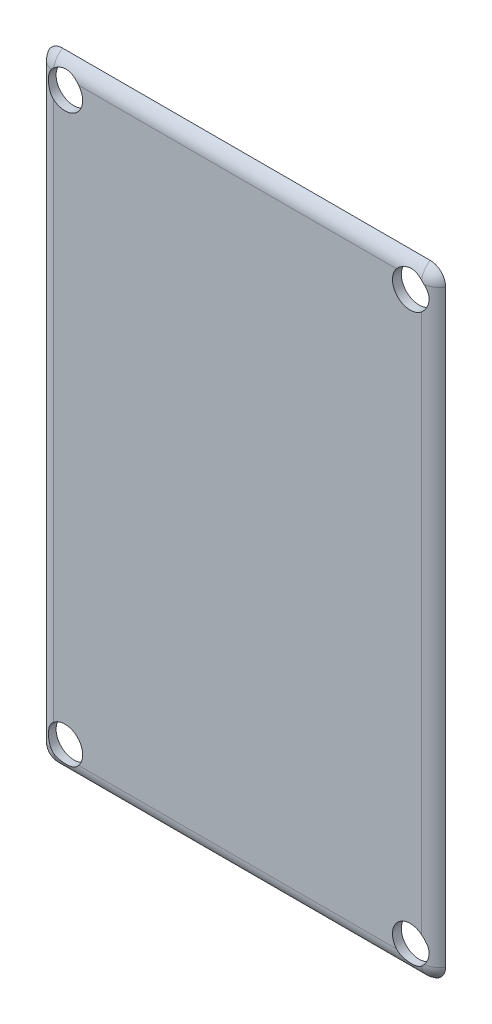
ISO-10303-21;
HEADER;
FILE_DESCRIPTION(('STEP AP214'),'2;1');
FILE_NAME('part.step','',(''),(''),'','','');
FILE_SCHEMA(('AUTOMOTIVE_DESIGN { 1 0 10303 214 1 1 1 1 }'));
ENDSEC;
DATA;
#1=APPLICATION_CONTEXT('core data for automotive mechanical design processes');
#2=APPLICATION_PROTOCOL_DEFINITION('international standard','automotive_design',2000,#1);
#3=PRODUCT_CONTEXT('',#1,'mechanical');
#4=PRODUCT('Part','Part','',(#3));
#5=PRODUCT_RELATED_PRODUCT_CATEGORY('part','',(#4));
#6=PRODUCT_DEFINITION_FORMATION('','',#4);
#7=PRODUCT_DEFINITION_CONTEXT('part definition',#1,'design');
#8=PRODUCT_DEFINITION('design','',#6,#7);
#9=PRODUCT_DEFINITION_SHAPE('','',#8);
#10=(LENGTH_UNIT() NAMED_UNIT(*) SI_UNIT(.MILLI.,.METRE.));
#11=(NAMED_UNIT(*) PLANE_ANGLE_UNIT() SI_UNIT($,.RADIAN.));
#12=(NAMED_UNIT(*) SI_UNIT($,.STERADIAN.) SOLID_ANGLE_UNIT());
#13=UNCERTAINTY_MEASURE_WITH_UNIT(LENGTH_MEASURE(1.E-05),#10,'distance_accuracy_value','');
#14=(GEOMETRIC_REPRESENTATION_CONTEXT(3) GLOBAL_UNCERTAINTY_ASSIGNED_CONTEXT((#13)) GLOBAL_UNIT_ASSIGNED_CONTEXT((#10,
#11,#12)) REPRESENTATION_CONTEXT('',''));
#15=CARTESIAN_POINT('',(0.,0.,0.));
#16=DIRECTION('',(0.,0.,1.));
#17=DIRECTION('',(1.,0.,0.));
#18=AXIS2_PLACEMENT_3D('',#15,#16,#17);
#19=CARTESIAN_POINT('',(0.,0.,1.));
#20=DIRECTION('',(0.,0.,-1.));
#21=DIRECTION('',(-1.,0.,0.));
#22=AXIS2_PLACEMENT_3D('',#19,#20,#21);
#23=PLANE('',#22);
#24=CARTESIAN_POINT('',(3.,3.,1.));
#25=DIRECTION('',(0.,0.,1.));
#26=DIRECTION('',(1.,0.,0.));
#27=AXIS2_PLACEMENT_3D('',#24,#25,#26);
#28=CIRCLE('',#27,2.);
#29=CARTESIAN_POINT('',(4.54670774402059,1.73205080756888,1.));
#30=VERTEX_POINT('',#29);
#31=CARTESIAN_POINT('',(1.73205080756888,4.54670774402059,1.));
#32=VERTEX_POINT('',#31);
#33=EDGE_CURVE('E132',#30,#32,#28,.T.);
#34=ORIENTED_EDGE('',*,*,#33,.F.);
#35=DIRECTION('',(-1.,0.,0.));
#36=VECTOR('',#35,1.);
#37=CARTESIAN_POINT('',(0.,1.73205080756888,1.));
#38=LINE('',#37,#36);
#39=CARTESIAN_POINT('',(40.4532922559794,1.73205080756888,1.));
#40=VERTEX_POINT('',#39);
#41=EDGE_CURVE('E140',#30,#40,#38,.F.);
#42=ORIENTED_EDGE('',*,*,#41,.T.);
#43=CARTESIAN_POINT('',(42.,3.,1.));
#44=DIRECTION('',(0.,0.,1.));
#45=DIRECTION('',(1.,0.,0.));
#46=AXIS2_PLACEMENT_3D('',#43,#44,#45);
#47=CIRCLE('',#46,2.);
#48=CARTESIAN_POINT('',(43.2679491924311,4.5467077440206,1.));
#49=VERTEX_POINT('',#48);
#50=EDGE_CURVE('E305',#49,#40,#47,.T.);
#51=ORIENTED_EDGE('',*,*,#50,.F.);
#52=DIRECTION('',(0.,-1.,0.));
#53=VECTOR('',#52,1.);
#54=CARTESIAN_POINT('',(43.2679491924311,0.,1.));
#55=LINE('',#54,#53);
#56=CARTESIAN_POINT('',(43.2679491924311,65.4532922559794,1.));
#57=VERTEX_POINT('',#56);
#58=EDGE_CURVE('E287',#49,#57,#55,.F.);
#59=ORIENTED_EDGE('',*,*,#58,.T.);
#60=CARTESIAN_POINT('',(42.,67.,1.));
#61=DIRECTION('',(0.,0.,1.));
#62=DIRECTION('',(1.,0.,0.));
#63=AXIS2_PLACEMENT_3D('',#60,#61,#62);
#64=CIRCLE('',#63,2.);
#65=CARTESIAN_POINT('',(40.4532922559794,68.2679491924311,1.));
#66=VERTEX_POINT('',#65);
#67=EDGE_CURVE('E311',#66,#57,#64,.T.);
#68=ORIENTED_EDGE('',*,*,#67,.F.);
#69=DIRECTION('',(1.,0.,0.));
#70=VECTOR('',#69,1.);
#71=CARTESIAN_POINT('',(0.,68.2679491924311,1.));
#72=LINE('',#71,#70);
#73=CARTESIAN_POINT('',(4.54670774402059,68.2679491924311,1.));
#74=VERTEX_POINT('',#73);
#75=EDGE_CURVE('E141',#66,#74,#72,.F.);
#76=ORIENTED_EDGE('',*,*,#75,.T.);
#77=CARTESIAN_POINT('',(3.,67.,1.));
#78=DIRECTION('',(0.,0.,1.));
#79=DIRECTION('',(1.,0.,0.));
#80=AXIS2_PLACEMENT_3D('',#77,#78,#79);
#81=CIRCLE('',#80,2.);
#82=CARTESIAN_POINT('',(1.73205080756888,65.4532922559794,1.));
#83=VERTEX_POINT('',#82);
#84=EDGE_CURVE('E135',#83,#74,#81,.T.);
#85=ORIENTED_EDGE('',*,*,#84,.F.);
#86=DIRECTION('',(0.,1.,0.));
#87=VECTOR('',#86,1.);
#88=CARTESIAN_POINT('',(1.73205080756888,0.,1.));
#89=LINE('',#88,#87);
#90=EDGE_CURVE('E129',#83,#32,#89,.F.);
#91=ORIENTED_EDGE('',*,*,#90,.T.);
#92=EDGE_LOOP('',(#34,#42,#51,#59,#68,#76,#85,#91));
#93=FACE_BOUND('',#92,.T.);
#94=ADVANCED_FACE('F39',(#93),#23,.F.);
#95=CARTESIAN_POINT('',(0.,0.,0.));
#96=DIRECTION('',(0.,0.,-1.));
#97=DIRECTION('',(-1.,0.,0.));
#98=AXIS2_PLACEMENT_3D('',#95,#96,#97);
#99=PLANE('',#98);
#100=CARTESIAN_POINT('',(42.,67.,0.));
#101=DIRECTION('',(0.,0.,1.));
#102=DIRECTION('',(1.,0.,0.));
#103=AXIS2_PLACEMENT_3D('',#100,#101,#102);
#104=CIRCLE('',#103,2.);
#105=CARTESIAN_POINT('',(44.,67.,0.));
#106=VERTEX_POINT('',#105);
#107=EDGE_CURVE('E315',#106,#106,#104,.T.);
#108=ORIENTED_EDGE('',*,*,#107,.T.);
#109=EDGE_LOOP('',(#108));
#110=FACE_BOUND('',#109,.T.);
#111=CARTESIAN_POINT('',(3.,3.,0.));
#112=DIRECTION('',(0.,0.,1.));
#113=DIRECTION('',(1.,0.,0.));
#114=AXIS2_PLACEMENT_3D('',#111,#112,#113);
#115=CIRCLE('',#114,2.);
#116=CARTESIAN_POINT('',(5.,3.,0.));
#117=VERTEX_POINT('',#116);
#118=EDGE_CURVE('E153',#117,#117,#115,.T.);
#119=ORIENTED_EDGE('',*,*,#118,.T.);
#120=EDGE_LOOP('',(#119));
#121=FACE_BOUND('',#120,.T.);
#122=DIRECTION('',(1.,0.,0.));
#123=VECTOR('',#122,1.);
#124=CARTESIAN_POINT('',(0.,0.,0.));
#125=LINE('',#124,#123);
#126=CARTESIAN_POINT('',(1.73205080756888,0.,0.));
#127=VERTEX_POINT('',#126);
#128=CARTESIAN_POINT('',(43.2679491924311,0.,0.));
#129=VERTEX_POINT('',#128);
#130=EDGE_CURVE('E297',#127,#129,#125,.T.);
#131=ORIENTED_EDGE('',*,*,#130,.F.);
#132=CARTESIAN_POINT('',(1.73205080756888,1.73205080756888,0.));
#133=DIRECTION('',(0.,0.,-1.));
#134=DIRECTION('',(-1.,0.,0.));
#135=AXIS2_PLACEMENT_3D('',#132,#133,#134);
#136=CIRCLE('',#135,1.73205080756888);
#137=CARTESIAN_POINT('',(0.,1.73205080756888,0.));
#138=VERTEX_POINT('',#137);
#139=EDGE_CURVE('E357',#127,#138,#136,.T.);
#140=ORIENTED_EDGE('',*,*,#139,.T.);
#141=DIRECTION('',(0.,-1.,0.));
#142=VECTOR('',#141,1.);
#143=CARTESIAN_POINT('',(0.,0.,0.));
#144=LINE('',#143,#142);
#145=CARTESIAN_POINT('',(0.,68.2679491924311,0.));
#146=VERTEX_POINT('',#145);
#147=EDGE_CURVE('E152',#146,#138,#144,.T.);
#148=ORIENTED_EDGE('',*,*,#147,.F.);
#149=CARTESIAN_POINT('',(1.73205080756888,68.2679491924311,0.));
#150=DIRECTION('',(0.,0.,-1.));
#151=DIRECTION('',(-1.,0.,0.));
#152=AXIS2_PLACEMENT_3D('',#149,#150,#151);
#153=CIRCLE('',#152,1.73205080756888);
#154=CARTESIAN_POINT('',(1.73205080756888,70.,0.));
#155=VERTEX_POINT('',#154);
#156=EDGE_CURVE('E342',#146,#155,#153,.T.);
#157=ORIENTED_EDGE('',*,*,#156,.T.);
#158=DIRECTION('',(-1.,0.,0.));
#159=VECTOR('',#158,1.);
#160=CARTESIAN_POINT('',(0.,70.,0.));
#161=LINE('',#160,#159);
#162=CARTESIAN_POINT('',(43.2679491924311,70.,0.));
#163=VERTEX_POINT('',#162);
#164=EDGE_CURVE('E290',#163,#155,#161,.T.);
#165=ORIENTED_EDGE('',*,*,#164,.F.);
#166=CARTESIAN_POINT('',(43.2679491924311,68.2679491924311,0.));
#167=DIRECTION('',(0.,0.,-1.));
#168=DIRECTION('',(-1.,0.,0.));
#169=AXIS2_PLACEMENT_3D('',#166,#167,#168);
#170=CIRCLE('',#169,1.73205080756888);
#171=CARTESIAN_POINT('',(45.,68.2679491924311,0.));
#172=VERTEX_POINT('',#171);
#173=EDGE_CURVE('E352',#163,#172,#170,.T.);
#174=ORIENTED_EDGE('',*,*,#173,.T.);
#175=DIRECTION('',(0.,1.,0.));
#176=VECTOR('',#175,1.);
#177=CARTESIAN_POINT('',(45.,0.,0.));
#178=LINE('',#177,#176);
#179=CARTESIAN_POINT('',(45.,1.73205080756888,0.));
#180=VERTEX_POINT('',#179);
#181=EDGE_CURVE('E293',#180,#172,#178,.T.);
#182=ORIENTED_EDGE('',*,*,#181,.F.);
#183=CARTESIAN_POINT('',(43.2679491924311,1.73205080756888,0.));
#184=DIRECTION('',(0.,0.,-1.));
#185=DIRECTION('',(-1.,0.,0.));
#186=AXIS2_PLACEMENT_3D('',#183,#184,#185);
#187=CIRCLE('',#186,1.73205080756888);
#188=EDGE_CURVE('E354',#180,#129,#187,.T.);
#189=ORIENTED_EDGE('',*,*,#188,.T.);
#190=EDGE_LOOP('',(#131,#140,#148,#157,#165,#174,#182,#189));
#191=FACE_BOUND('',#190,.T.);
#192=CARTESIAN_POINT('',(42.,3.,0.));
#193=DIRECTION('',(0.,0.,1.));
#194=DIRECTION('',(1.,0.,0.));
#195=AXIS2_PLACEMENT_3D('',#192,#193,#194);
#196=CIRCLE('',#195,2.);
#197=CARTESIAN_POINT('',(44.,3.,0.));
#198=VERTEX_POINT('',#197);
#199=EDGE_CURVE('E307',#198,#198,#196,.T.);
#200=ORIENTED_EDGE('',*,*,#199,.T.);
#201=EDGE_LOOP('',(#200));
#202=FACE_BOUND('',#201,.T.);
#203=CARTESIAN_POINT('',(3.,67.,0.));
#204=DIRECTION('',(0.,0.,1.));
#205=DIRECTION('',(1.,0.,0.));
#206=AXIS2_PLACEMENT_3D('',#203,#204,#205);
#207=CIRCLE('',#206,2.);
#208=CARTESIAN_POINT('',(5.,67.,0.));
#209=VERTEX_POINT('',#208);
#210=EDGE_CURVE('E322',#209,#209,#207,.T.);
#211=ORIENTED_EDGE('',*,*,#210,.T.);
#212=EDGE_LOOP('',(#211));
#213=FACE_BOUND('',#212,.T.);
#214=ADVANCED_FACE('F377',(#110,#121,#191,#202,#213),#99,.T.);
#215=CARTESIAN_POINT('',(3.,3.,1.));
#216=DIRECTION('',(0.,0.,-1.));
#217=DIRECTION('',(-1.,0.,0.));
#218=AXIS2_PLACEMENT_3D('',#215,#216,#217);
#219=CYLINDRICAL_SURFACE('',#218,2.);
#220=CARTESIAN_POINT('',(1.73205080756888,4.54670774402059,1.));
#221=CARTESIAN_POINT('',(1.68942090742648,4.51176501398997,0.99999994952929));
#222=CARTESIAN_POINT('',(1.64827955739233,4.47508684268151,0.998637351965732));
#223=CARTESIAN_POINT('',(1.56925683016252,4.39856871271128,0.993756114654367));
#224=CARTESIAN_POINT('',(1.53137248495384,4.35873169765017,0.990239462099776));
#225=CARTESIAN_POINT('',(1.42309253267321,4.23504683389057,0.977327109578218));
#226=CARTESIAN_POINT('',(1.35785797276758,4.14685056381454,0.965563417623844));
#227=CARTESIAN_POINT('',(1.24291285980056,3.96152346106263,0.940158015800067));
#228=CARTESIAN_POINT('',(1.19316416453257,3.86441535560524,0.926521041357541));
#229=CARTESIAN_POINT('',(1.10999943956261,3.66313191366588,0.901301177702394));
#230=CARTESIAN_POINT('',(1.07658554196436,3.55895565663139,0.889718556760454));
#231=CARTESIAN_POINT('',(1.02633374124687,3.34258403755406,0.871555789387361));
#232=CARTESIAN_POINT('',(1.01007205655011,3.23023794549001,0.86515113449693));
#233=CARTESIAN_POINT('',(0.996809596749699,3.00429539104492,0.85996765158949));
#234=CARTESIAN_POINT('',(0.999795040508532,2.89069988142584,0.861183367293215));
#235=CARTESIAN_POINT('',(1.02400942586525,2.67349712188182,0.87051166867929));
#236=CARTESIAN_POINT('',(1.04400915503521,2.56972877686385,0.878159169435495));
#237=CARTESIAN_POINT('',(1.09991864939778,2.36692401757929,0.897703790653173));
#238=CARTESIAN_POINT('',(1.13584745671772,2.2678934244253,0.909605994013024));
#239=CARTESIAN_POINT('',(1.22870909902796,2.06364863875985,0.936305671339136));
#240=CARTESIAN_POINT('',(1.28784302529463,1.9594420378841,0.951276473734035));
#241=CARTESIAN_POINT('',(1.38986004665449,1.81213185110468,0.970812431575449));
#242=CARTESIAN_POINT('',(1.42610285787408,1.76451054210445,0.976839601412846));
#243=CARTESIAN_POINT('',(1.50282428887054,1.67257870500859,0.987197266390099));
#244=CARTESIAN_POINT('',(1.54330494581549,1.62826978691197,0.991526940740406));
#245=CARTESIAN_POINT('',(1.5857864376269,1.5857864376269,0.994644513211687));
#246=B_SPLINE_CURVE_WITH_KNOTS('',3,(#220,#221,#222,#223,#224,#225,#226,#227,#228,#229,#230,
#231,#232,#233,#234,#235,#236,#237,#238,#239,#240,#241,#242,#243,#244,#245),.UNSPECIFIED.,.F.,
.F.,(4,2,2,2,2,2,2,2,2,2,2,2,4),(0.,0.165212127740173,0.330272070422933,0.659579373309191,
0.988069043263213,1.31660157797707,1.65585005475403,1.99485565320083,2.31126614131278,
2.62805590079043,2.98818591899734,3.16840034679873,3.34870180648225),.UNSPECIFIED.);
#247=CARTESIAN_POINT('',(1.45329225597941,1.73205080756888,0.980478141741469));
#248=VERTEX_POINT('',#247);
#249=EDGE_CURVE('E147',#32,#248,#246,.T.);
#250=ORIENTED_EDGE('',*,*,#249,.T.);
#251=CARTESIAN_POINT('',(1.45329225597941,1.73205080756888,0.980478141741469));
#252=CARTESIAN_POINT('',(1.49516195181283,1.68100098620581,0.986342452939327));
#253=CARTESIAN_POINT('',(1.53932667902866,1.63224619622515,0.989274608538257));
#254=CARTESIAN_POINT('',(1.63224619622515,1.53932667902866,0.989274608538257));
#255=CARTESIAN_POINT('',(1.68100098620581,1.49516195181283,0.986342452939328));
#256=CARTESIAN_POINT('',(1.73205080756888,1.45329225597941,0.980478141741469));
#257=B_SPLINE_CURVE_WITH_KNOTS('',3,(#251,#252,#253,#254,#255,#256),.UNSPECIFIED.,.F.,.F.,(4,2,
4),(0.,0.197548353354486,0.395096706708971),.UNSPECIFIED.);
#258=CARTESIAN_POINT('',(1.73205080756888,1.45329225597941,0.980478141741469));
#259=VERTEX_POINT('',#258);
#260=EDGE_CURVE('E253',#248,#259,#257,.T.);
#261=ORIENTED_EDGE('',*,*,#260,.T.);
#262=CARTESIAN_POINT('',(1.5857864376269,1.5857864376269,0.994644513211685));
#263=CARTESIAN_POINT('',(1.62547790093061,1.54609521000282,0.991732114062964));
#264=CARTESIAN_POINT('',(1.66676888227213,1.5081469392458,0.987760648980565));
#265=CARTESIAN_POINT('',(1.7522623619633,1.43594071238718,0.978293495590112));
#266=CARTESIAN_POINT('',(1.79646325547829,1.40168074918575,0.972798642158532));
#267=CARTESIAN_POINT('',(1.9331026581126,1.30465253951394,0.954907343353973));
#268=CARTESIAN_POINT('',(2.02954723121612,1.24766650896851,0.941107280589293));
#269=CARTESIAN_POINT('',(2.23054449822809,1.15056736922675,0.914268959196729));
#270=CARTESIAN_POINT('',(2.33509156877025,1.11044267980462,0.901230183040374));
#271=CARTESIAN_POINT('',(2.5497763489647,1.04814084773677,0.879725051697459));
#272=CARTESIAN_POINT('',(2.65990663248714,1.02594049705345,0.871252788633561));
#273=CARTESIAN_POINT('',(2.88114449692771,1.00047567891466,0.861448691684427));
#274=CARTESIAN_POINT('',(2.99221810171246,0.996956338547368,0.860020768031279));
#275=CARTESIAN_POINT('',(3.21329671443733,1.00832669230901,0.864472262637201));
#276=CARTESIAN_POINT('',(3.32330134213203,1.02322271158814,0.870354191625569));
#277=CARTESIAN_POINT('',(3.53371767710658,1.06966260178721,0.887273960773298));
#278=CARTESIAN_POINT('',(3.63433658802757,1.10037676865242,0.898051940207506));
#279=CARTESIAN_POINT('',(3.82927857343943,1.17701249896315,0.921858243254639));
#280=CARTESIAN_POINT('',(3.92360085153713,1.22293598170876,0.934886850780407));
#281=CARTESIAN_POINT('',(4.11463818683418,1.33530231731338,0.961194415055279));
#282=CARTESIAN_POINT('',(4.21035368078922,1.40351146666493,0.974325972163911));
#283=CARTESIAN_POINT('',(4.34420653824554,1.51791435091081,0.988876128459159));
#284=CARTESIAN_POINT('',(4.38726662198028,1.55813937245688,0.992870617265208));
#285=CARTESIAN_POINT('',(4.46978599965384,1.64235168439409,0.99843361559077));
#286=CARTESIAN_POINT('',(4.50924173652149,1.68634261012405,0.999999752438308));
#287=CARTESIAN_POINT('',(4.54670774402059,1.73205080756888,1.));
#288=B_SPLINE_CURVE_WITH_KNOTS('',3,(#262,#263,#264,#265,#266,#267,#268,#269,#270,#271,#272,
#273,#274,#275,#276,#277,#278,#279,#280,#281,#282,#283,#284,#285,#286,#287),.UNSPECIFIED.,.F.,
.F.,(4,2,2,2,2,2,2,2,2,2,2,2,4),(0.,0.168482724473795,0.336873295723139,0.673782866276044,
1.01046067052941,1.34670184956735,1.67834353076247,2.01009915305919,2.32599866069285,
2.64193804764297,2.99465461936718,3.17159360464045,3.34870536314445),.UNSPECIFIED.);
#289=EDGE_CURVE('E150',#259,#30,#288,.T.);
#290=ORIENTED_EDGE('',*,*,#289,.T.);
#291=ORIENTED_EDGE('',*,*,#33,.T.);
#292=EDGE_LOOP('',(#250,#261,#290,#291));
#293=FACE_BOUND('',#292,.T.);
#294=ORIENTED_EDGE('',*,*,#118,.F.);
#295=EDGE_LOOP('',(#294));
#296=FACE_BOUND('',#295,.T.);
#297=ADVANCED_FACE('F145',(#293,#296),#219,.F.);
#298=CARTESIAN_POINT('',(42.,3.,1.));
#299=DIRECTION('',(0.,0.,-1.));
#300=DIRECTION('',(-1.,0.,0.));
#301=AXIS2_PLACEMENT_3D('',#298,#299,#300);
#302=CYLINDRICAL_SURFACE('',#301,2.);
#303=CARTESIAN_POINT('',(40.4532922559794,1.73205080756888,1.));
#304=CARTESIAN_POINT('',(40.48823498601,1.68942090742648,0.999999949529289));
#305=CARTESIAN_POINT('',(40.5249131573185,1.64827955739233,0.998637351965732));
#306=CARTESIAN_POINT('',(40.6014312872887,1.56925683016252,0.993756114654367));
#307=CARTESIAN_POINT('',(40.6412683023498,1.53137248495384,0.990239462099776));
#308=CARTESIAN_POINT('',(40.7649531661094,1.42309253267321,0.977327109578219));
#309=CARTESIAN_POINT('',(40.8531494361855,1.35785797276758,0.965563417623844));
#310=CARTESIAN_POINT('',(41.0384765389374,1.24291285980056,0.940158015800066));
#311=CARTESIAN_POINT('',(41.1355846443948,1.19316416453257,0.926521041357541));
#312=CARTESIAN_POINT('',(41.3368680863341,1.1099994395626,0.901301177702394));
#313=CARTESIAN_POINT('',(41.4410443433686,1.07658554196436,0.889718556760453));
#314=CARTESIAN_POINT('',(41.6574159624459,1.02633374124687,0.87155578938736));
#315=CARTESIAN_POINT('',(41.76976205451,1.0100720565501,0.865151134496928));
#316=CARTESIAN_POINT('',(41.9957046089551,0.996809596749696,0.859967651589488));
#317=CARTESIAN_POINT('',(42.1093001185742,0.999795040508528,0.861183367293213));
#318=CARTESIAN_POINT('',(42.3265028781182,1.02400942586525,0.870511668679288));
#319=CARTESIAN_POINT('',(42.4302712231361,1.04400915503521,0.878159169435493));
#320=CARTESIAN_POINT('',(42.6330759824207,1.09991864939778,0.897703790653171));
#321=CARTESIAN_POINT('',(42.7321065755747,1.13584745671771,0.909605994013023));
#322=CARTESIAN_POINT('',(42.9363513612401,1.22870909902795,0.936305671339134));
#323=CARTESIAN_POINT('',(43.0405579621159,1.28784302529463,0.951276473734033));
#324=CARTESIAN_POINT('',(43.1878681488953,1.38986004665448,0.970812431575447));
#325=CARTESIAN_POINT('',(43.2354894578955,1.42610285787407,0.976839601412845));
#326=CARTESIAN_POINT('',(43.3274212949914,1.50282428887053,0.987197266390098));
#327=CARTESIAN_POINT('',(43.371730213088,1.54330494581548,0.991526940740405));
#328=CARTESIAN_POINT('',(43.4142135623731,1.5857864376269,0.994644513211686));
#329=B_SPLINE_CURVE_WITH_KNOTS('',3,(#303,#304,#305,#306,#307,#308,#309,#310,#311,#312,#313,
#314,#315,#316,#317,#318,#319,#320,#321,#322,#323,#324,#325,#326,#327,#328),.UNSPECIFIED.,.F.,
.F.,(4,2,2,2,2,2,2,2,2,2,2,2,4),(0.,0.165212127740179,0.330272070422937,0.659579373309193,
0.988069043263215,1.31660157797707,1.65585005475403,1.99485565320083,2.31126614131278,
2.62805590079043,2.98818591899734,3.16840034679872,3.34870180648225),.UNSPECIFIED.);
#330=CARTESIAN_POINT('',(43.2679491924311,1.4532922559794,0.980478141741468));
#331=VERTEX_POINT('',#330);
#332=EDGE_CURVE('E160',#40,#331,#329,.T.);
#333=ORIENTED_EDGE('',*,*,#332,.T.);
#334=CARTESIAN_POINT('',(43.2679491924311,1.4532922559794,0.980478141741468));
#335=CARTESIAN_POINT('',(43.3189990137942,1.49516195181282,0.986342452939327));
#336=CARTESIAN_POINT('',(43.3677538037748,1.53932667902865,0.989274608538256));
#337=CARTESIAN_POINT('',(43.4606733209713,1.63224619622514,0.989274608538257));
#338=CARTESIAN_POINT('',(43.5048380481872,1.6810009862058,0.986342452939327));
#339=CARTESIAN_POINT('',(43.5467077440206,1.73205080756888,0.980478141741468));
#340=B_SPLINE_CURVE_WITH_KNOTS('',3,(#334,#335,#336,#337,#338,#339),.UNSPECIFIED.,.F.,.F.,(4,2,
4),(0.,0.197548353354486,0.395096706708985),.UNSPECIFIED.);
#341=CARTESIAN_POINT('',(43.5467077440206,1.73205080756888,0.980478141741467));
#342=VERTEX_POINT('',#341);
#343=EDGE_CURVE('E261',#331,#342,#340,.T.);
#344=ORIENTED_EDGE('',*,*,#343,.T.);
#345=CARTESIAN_POINT('',(43.4142135623731,1.5857864376269,0.994644513211685));
#346=CARTESIAN_POINT('',(43.4539047899972,1.62547790093061,0.991732114062964));
#347=CARTESIAN_POINT('',(43.4918530607542,1.66676888227213,0.987760648980566));
#348=CARTESIAN_POINT('',(43.5640592876128,1.75226236196329,0.978293495590112));
#349=CARTESIAN_POINT('',(43.5983192508142,1.79646325547828,0.972798642158531));
#350=CARTESIAN_POINT('',(43.6953474604861,1.9331026581126,0.954907343353971));
#351=CARTESIAN_POINT('',(43.7523334910315,2.02954723121611,0.941107280589291));
#352=CARTESIAN_POINT('',(43.8494326307732,2.23054449822808,0.914268959196726));
#353=CARTESIAN_POINT('',(43.8895573201954,2.33509156877025,0.901230183040371));
#354=CARTESIAN_POINT('',(43.9518591522632,2.5497763489647,0.879725051697457));
#355=CARTESIAN_POINT('',(43.9740595029466,2.65990663248713,0.871252788633558));
#356=CARTESIAN_POINT('',(43.9995243210853,2.8811444969277,0.861448691684425));
#357=CARTESIAN_POINT('',(44.0030436614526,2.99221810171246,0.860020768031276));
#358=CARTESIAN_POINT('',(43.991673307691,3.21329671443733,0.864472262637197));
#359=CARTESIAN_POINT('',(43.9767772884119,3.32330134213202,0.870354191625566));
#360=CARTESIAN_POINT('',(43.9303373982128,3.53371767710657,0.887273960773295));
#361=CARTESIAN_POINT('',(43.8996232313476,3.63433658802757,0.898051940207503));
#362=CARTESIAN_POINT('',(43.8229875010369,3.82927857343942,0.921858243254635));
#363=CARTESIAN_POINT('',(43.7770640182912,3.92360085153713,0.934886850780403));
#364=CARTESIAN_POINT('',(43.6646976826866,4.11463818683418,0.961194415055277));
#365=CARTESIAN_POINT('',(43.5964885333351,4.21035368078922,0.97432597216391));
#366=CARTESIAN_POINT('',(43.4820856490892,4.34420653824555,0.988876128459159));
#367=CARTESIAN_POINT('',(43.4418606275431,4.38726662198029,0.992870617265208));
#368=CARTESIAN_POINT('',(43.3576483156059,4.46978599965384,0.99843361559077));
#369=CARTESIAN_POINT('',(43.3136573898759,4.50924173652149,0.999999752438309));
#370=CARTESIAN_POINT('',(43.2679491924311,4.5467077440206,1.));
#371=B_SPLINE_CURVE_WITH_KNOTS('',3,(#345,#346,#347,#348,#349,#350,#351,#352,#353,#354,#355,
#356,#357,#358,#359,#360,#361,#362,#363,#364,#365,#366,#367,#368,#369,#370),.UNSPECIFIED.,.F.,
.F.,(4,2,2,2,2,2,2,2,2,2,2,2,4),(0.,0.168482724473791,0.336873295723138,0.673782866276042,
1.0104606705294,1.34670184956735,1.67834353076246,2.01009915305919,2.32599866069285,
2.64193804764297,2.99465461936719,3.17159360464046,3.34870536314447),.UNSPECIFIED.);
#372=EDGE_CURVE('E167',#342,#49,#371,.T.);
#373=ORIENTED_EDGE('',*,*,#372,.T.);
#374=ORIENTED_EDGE('',*,*,#50,.T.);
#375=EDGE_LOOP('',(#333,#344,#373,#374));
#376=FACE_BOUND('',#375,.T.);
#377=ORIENTED_EDGE('',*,*,#199,.F.);
#378=EDGE_LOOP('',(#377));
#379=FACE_BOUND('',#378,.T.);
#380=ADVANCED_FACE('F271',(#376,#379),#302,.F.);
#381=CARTESIAN_POINT('',(42.,67.,1.));
#382=DIRECTION('',(0.,0.,-1.));
#383=DIRECTION('',(-1.,0.,0.));
#384=AXIS2_PLACEMENT_3D('',#381,#382,#383);
#385=CYLINDRICAL_SURFACE('',#384,2.);
#386=CARTESIAN_POINT('',(43.2679491924311,65.4532922559794,1.));
#387=CARTESIAN_POINT('',(43.3105790925735,65.48823498601,0.99999994952929));
#388=CARTESIAN_POINT('',(43.3517204426077,65.5249131573185,0.998637351965732));
#389=CARTESIAN_POINT('',(43.4307431698375,65.6014312872887,0.993756114654367));
#390=CARTESIAN_POINT('',(43.4686275150462,65.6412683023498,0.990239462099776));
#391=CARTESIAN_POINT('',(43.5769074673268,65.7649531661094,0.977327109578218));
#392=CARTESIAN_POINT('',(43.6421420272324,65.8531494361855,0.965563417623843));
#393=CARTESIAN_POINT('',(43.7570871401994,66.0384765389374,0.940158015800065));
#394=CARTESIAN_POINT('',(43.8068358354674,66.1355846443948,0.926521041357538));
#395=CARTESIAN_POINT('',(43.8900005604374,66.3368680863341,0.90130117770239));
#396=CARTESIAN_POINT('',(43.9234144580356,66.4410443433686,0.88971855676045));
#397=CARTESIAN_POINT('',(43.9736662587531,66.6574159624459,0.871555789387357));
#398=CARTESIAN_POINT('',(43.9899279434499,66.76976205451,0.865151134496926));
#399=CARTESIAN_POINT('',(44.0031904032503,66.9957046089551,0.859967651589487));
#400=CARTESIAN_POINT('',(44.0002049594915,67.1093001185742,0.861183367293211));
#401=CARTESIAN_POINT('',(43.9759905741348,67.3265028781182,0.870511668679287));
#402=CARTESIAN_POINT('',(43.9559908449648,67.4302712231361,0.878159169435492));
#403=CARTESIAN_POINT('',(43.9000813506022,67.6330759824207,0.89770379065317));
#404=CARTESIAN_POINT('',(43.8641525432823,67.7321065755747,0.909605994013022));
#405=CARTESIAN_POINT('',(43.7712909009721,67.9363513612402,0.936305671339133));
#406=CARTESIAN_POINT('',(43.7121569747054,68.0405579621159,0.951276473734032));
#407=CARTESIAN_POINT('',(43.6101399533455,68.1878681488953,0.970812431575447));
#408=CARTESIAN_POINT('',(43.5738971421259,68.2354894578956,0.976839601412845));
#409=CARTESIAN_POINT('',(43.4971757111295,68.3274212949914,0.987197266390098));
#410=CARTESIAN_POINT('',(43.4566950541845,68.371730213088,0.991526940740405));
#411=CARTESIAN_POINT('',(43.4142135623731,68.4142135623731,0.994644513211685));
#412=B_SPLINE_CURVE_WITH_KNOTS('',3,(#386,#387,#388,#389,#390,#391,#392,#393,#394,#395,#396,
#397,#398,#399,#400,#401,#402,#403,#404,#405,#406,#407,#408,#409,#410,#411),.UNSPECIFIED.,.F.,
.F.,(4,2,2,2,2,2,2,2,2,2,2,2,4),(0.,0.165212127740168,0.330272070422939,0.659579373309203,
0.988069043263237,1.31660157797709,1.65585005475406,1.99485565320086,2.31126614131279,
2.62805590079045,2.98818591899735,3.16840034679875,3.34870180648228),.UNSPECIFIED.);
#413=CARTESIAN_POINT('',(43.5467077440206,68.2679491924311,0.980478141741469));
#414=VERTEX_POINT('',#413);
#415=EDGE_CURVE('E208',#57,#414,#412,.T.);
#416=ORIENTED_EDGE('',*,*,#415,.T.);
#417=CARTESIAN_POINT('',(43.5467077440206,68.2679491924311,0.980478141741468));
#418=CARTESIAN_POINT('',(43.5048380481872,68.3189990137942,0.986342452939327));
#419=CARTESIAN_POINT('',(43.4606733209713,68.3677538037749,0.989274608538257));
#420=CARTESIAN_POINT('',(43.3677538037749,68.4606733209714,0.989274608538257));
#421=CARTESIAN_POINT('',(43.3189990137942,68.5048380481872,0.986342452939328));
#422=CARTESIAN_POINT('',(43.2679491924311,68.5467077440206,0.980478141741469));
#423=B_SPLINE_CURVE_WITH_KNOTS('',3,(#417,#418,#419,#420,#421,#422),.UNSPECIFIED.,.F.,.F.,(4,2,
4),(0.,0.197548353354484,0.395096706708983),.UNSPECIFIED.);
#424=CARTESIAN_POINT('',(43.2679491924311,68.5467077440206,0.980478141741469));
#425=VERTEX_POINT('',#424);
#426=EDGE_CURVE('E49',#414,#425,#423,.T.);
#427=ORIENTED_EDGE('',*,*,#426,.T.);
#428=CARTESIAN_POINT('',(43.4142135623731,68.4142135623731,0.994644513211685));
#429=CARTESIAN_POINT('',(43.3745220990694,68.4539047899972,0.991732114062964));
#430=CARTESIAN_POINT('',(43.3332311177279,68.4918530607542,0.987760648980566));
#431=CARTESIAN_POINT('',(43.2477376380367,68.5640592876128,0.978293495590112));
#432=CARTESIAN_POINT('',(43.2035367445217,68.5983192508143,0.972798642158531));
#433=CARTESIAN_POINT('',(43.0668973418874,68.6953474604861,0.954907343353971));
#434=CARTESIAN_POINT('',(42.9704527687839,68.7523334910315,0.941107280589292));
#435=CARTESIAN_POINT('',(42.7694555017719,68.8494326307733,0.914268959196728));
#436=CARTESIAN_POINT('',(42.6649084312297,68.8895573201954,0.901230183040373));
#437=CARTESIAN_POINT('',(42.4502236510353,68.9518591522633,0.879725051697458));
#438=CARTESIAN_POINT('',(42.3400933675128,68.9740595029466,0.871252788633561));
#439=CARTESIAN_POINT('',(42.1188555030723,68.9995243210853,0.861448691684429));
#440=CARTESIAN_POINT('',(42.0077818982875,69.0030436614526,0.860020768031281));
#441=CARTESIAN_POINT('',(41.7867032855626,68.991673307691,0.864472262637204));
#442=CARTESIAN_POINT('',(41.6766986578679,68.9767772884119,0.870354191625573));
#443=CARTESIAN_POINT('',(41.4662823228934,68.9303373982128,0.887273960773303));
#444=CARTESIAN_POINT('',(41.3656634119724,68.8996232313476,0.898051940207512));
#445=CARTESIAN_POINT('',(41.1707214265605,68.8229875010368,0.921858243254644));
#446=CARTESIAN_POINT('',(41.0763991484628,68.7770640182912,0.934886850780411));
#447=CARTESIAN_POINT('',(40.8853618131658,68.6646976826866,0.961194415055283));
#448=CARTESIAN_POINT('',(40.7896463192108,68.5964885333351,0.974325972163914));
#449=CARTESIAN_POINT('',(40.6557934617544,68.4820856490892,0.98887612845916));
#450=CARTESIAN_POINT('',(40.6127333780197,68.4418606275431,0.992870617265209));
#451=CARTESIAN_POINT('',(40.5302140003462,68.3576483156059,0.99843361559077));
#452=CARTESIAN_POINT('',(40.4907582634785,68.313657389876,0.999999752438308));
#453=CARTESIAN_POINT('',(40.4532922559794,68.2679491924311,1.));
#454=B_SPLINE_CURVE_WITH_KNOTS('',3,(#428,#429,#430,#431,#432,#433,#434,#435,#436,#437,#438,
#439,#440,#441,#442,#443,#444,#445,#446,#447,#448,#449,#450,#451,#452,#453),.UNSPECIFIED.,.F.,
.F.,(4,2,2,2,2,2,2,2,2,2,2,2,4),(0.,0.168482724473799,0.336873295723139,0.673782866276056,
1.01046067052943,1.34670184956737,1.67834353076249,2.01009915305923,2.32599866069288,
2.64193804764299,2.99465461936719,3.17159360464044,3.34870536314444),.UNSPECIFIED.);
#455=EDGE_CURVE('E337',#425,#66,#454,.T.);
#456=ORIENTED_EDGE('',*,*,#455,.T.);
#457=ORIENTED_EDGE('',*,*,#67,.T.);
#458=EDGE_LOOP('',(#416,#427,#456,#457));
#459=FACE_BOUND('',#458,.T.);
#460=ORIENTED_EDGE('',*,*,#107,.F.);
#461=EDGE_LOOP('',(#460));
#462=FACE_BOUND('',#461,.T.);
#463=ADVANCED_FACE('F222',(#459,#462),#385,.F.);
#464=CARTESIAN_POINT('',(3.,67.,1.));
#465=DIRECTION('',(0.,0.,-1.));
#466=DIRECTION('',(-1.,0.,0.));
#467=AXIS2_PLACEMENT_3D('',#464,#465,#466);
#468=CYLINDRICAL_SURFACE('',#467,2.);
#469=CARTESIAN_POINT('',(4.54670774402059,68.2679491924311,1.));
#470=CARTESIAN_POINT('',(4.51176501398997,68.3105790925735,0.99999994952929));
#471=CARTESIAN_POINT('',(4.4750868426815,68.3517204426077,0.998637351965732));
#472=CARTESIAN_POINT('',(4.39856871271128,68.4307431698375,0.993756114654368));
#473=CARTESIAN_POINT('',(4.35873169765017,68.4686275150462,0.990239462099777));
#474=CARTESIAN_POINT('',(4.23504683389057,68.5769074673268,0.97732710957822));
#475=CARTESIAN_POINT('',(4.14685056381454,68.6421420272324,0.965563417623846));
#476=CARTESIAN_POINT('',(3.96152346106263,68.7570871401994,0.940158015800068));
#477=CARTESIAN_POINT('',(3.86441535560524,68.8068358354674,0.926521041357543));
#478=CARTESIAN_POINT('',(3.66313191366587,68.8900005604374,0.901301177702396));
#479=CARTESIAN_POINT('',(3.55895565663138,68.9234144580357,0.889718556760456));
#480=CARTESIAN_POINT('',(3.34258403755405,68.9736662587531,0.871555789387363));
#481=CARTESIAN_POINT('',(3.23023794549,68.9899279434499,0.865151134496932));
#482=CARTESIAN_POINT('',(3.00429539104491,69.0031904032503,0.859967651589493));
#483=CARTESIAN_POINT('',(2.89069988142584,69.0002049594915,0.861183367293218));
#484=CARTESIAN_POINT('',(2.67349712188181,68.9759905741348,0.870511668679293));
#485=CARTESIAN_POINT('',(2.56972877686384,68.9559908449648,0.878159169435498));
#486=CARTESIAN_POINT('',(2.36692401757928,68.9000813506022,0.897703790653176));
#487=CARTESIAN_POINT('',(2.26789342442529,68.8641525432823,0.909605994013028));
#488=CARTESIAN_POINT('',(2.06364863875985,68.771290900972,0.936305671339138));
#489=CARTESIAN_POINT('',(1.95944203788411,68.7121569747054,0.951276473734035));
#490=CARTESIAN_POINT('',(1.81213185110469,68.6101399533455,0.970812431575449));
#491=CARTESIAN_POINT('',(1.76451054210446,68.5738971421259,0.976839601412847));
#492=CARTESIAN_POINT('',(1.6725787050086,68.4971757111295,0.9871972663901));
#493=CARTESIAN_POINT('',(1.62826978691198,68.4566950541845,0.991526940740406));
#494=CARTESIAN_POINT('',(1.58578643762691,68.4142135623731,0.994644513211687));
#495=B_SPLINE_CURVE_WITH_KNOTS('',3,(#469,#470,#471,#472,#473,#474,#475,#476,#477,#478,#479,
#480,#481,#482,#483,#484,#485,#486,#487,#488,#489,#490,#491,#492,#493,#494),.UNSPECIFIED.,.F.,
.F.,(4,2,2,2,2,2,2,2,2,2,2,2,4),(0.,0.165212127740173,0.330272070422928,0.659579373309185,
0.988069043263209,1.31660157797707,1.65585005475403,1.99485565320083,2.31126614131278,
2.62805590079043,2.98818591899732,3.16840034679871,3.34870180648224),.UNSPECIFIED.);
#496=CARTESIAN_POINT('',(1.73205080756888,68.5467077440206,0.980478141741469));
#497=VERTEX_POINT('',#496);
#498=EDGE_CURVE('E164',#74,#497,#495,.T.);
#499=ORIENTED_EDGE('',*,*,#498,.T.);
#500=CARTESIAN_POINT('',(1.73205080756888,68.5467077440206,0.98047814174147));
#501=CARTESIAN_POINT('',(1.68100098620581,68.5048380481872,0.986342452939329));
#502=CARTESIAN_POINT('',(1.63224619622515,68.4606733209714,0.989274608538258));
#503=CARTESIAN_POINT('',(1.53932667902866,68.3677538037749,0.989274608538258));
#504=CARTESIAN_POINT('',(1.49516195181283,68.3189990137942,0.986342452939329));
#505=CARTESIAN_POINT('',(1.45329225597941,68.2679491924311,0.98047814174147));
#506=B_SPLINE_CURVE_WITH_KNOTS('',3,(#500,#501,#502,#503,#504,#505),.UNSPECIFIED.,.F.,.F.,(4,2,
4),(0.,0.197548353354475,0.395096706708962),.UNSPECIFIED.);
#507=CARTESIAN_POINT('',(1.45329225597942,68.2679491924311,0.98047814174147));
#508=VERTEX_POINT('',#507);
#509=EDGE_CURVE('E228',#497,#508,#506,.T.);
#510=ORIENTED_EDGE('',*,*,#509,.T.);
#511=CARTESIAN_POINT('',(1.58578643762691,68.4142135623731,0.994644513211686));
#512=CARTESIAN_POINT('',(1.54609521000282,68.3745220990694,0.991732114062965));
#513=CARTESIAN_POINT('',(1.5081469392458,68.3332311177279,0.987760648980566));
#514=CARTESIAN_POINT('',(1.43594071238718,68.2477376380367,0.978293495590113));
#515=CARTESIAN_POINT('',(1.40168074918575,68.2035367445217,0.972798642158532));
#516=CARTESIAN_POINT('',(1.30465253951393,68.0668973418874,0.954907343353972));
#517=CARTESIAN_POINT('',(1.24766650896851,67.9704527687839,0.941107280589292));
#518=CARTESIAN_POINT('',(1.15056736922675,67.7694555017719,0.914268959196726));
#519=CARTESIAN_POINT('',(1.11044267980461,67.6649084312297,0.90123018304037));
#520=CARTESIAN_POINT('',(1.04814084773676,67.4502236510353,0.879725051697457));
#521=CARTESIAN_POINT('',(1.02594049705345,67.3400933675128,0.87125278863356));
#522=CARTESIAN_POINT('',(1.00047567891466,67.1188555030723,0.861448691684427));
#523=CARTESIAN_POINT('',(0.996956338547368,67.0077818982875,0.860020768031278));
#524=CARTESIAN_POINT('',(1.00832669230902,66.7867032855627,0.864472262637201));
#525=CARTESIAN_POINT('',(1.02322271158814,66.676698657868,0.87035419162557));
#526=CARTESIAN_POINT('',(1.06966260178722,66.4662823228934,0.8872739607733));
#527=CARTESIAN_POINT('',(1.10037676865242,66.3656634119724,0.898051940207508));
#528=CARTESIAN_POINT('',(1.17701249896316,66.1707214265605,0.921858243254642));
#529=CARTESIAN_POINT('',(1.22293598170877,66.0763991484628,0.93488685078041));
#530=CARTESIAN_POINT('',(1.3353023173134,65.8853618131658,0.961194415055282));
#531=CARTESIAN_POINT('',(1.40351146666494,65.7896463192108,0.974325972163912));
#532=CARTESIAN_POINT('',(1.51791435091082,65.6557934617545,0.988876128459159));
#533=CARTESIAN_POINT('',(1.55813937245688,65.6127333780197,0.992870617265209));
#534=CARTESIAN_POINT('',(1.6423516843941,65.5302140003462,0.99843361559077));
#535=CARTESIAN_POINT('',(1.68634261012405,65.4907582634785,0.999999752438308));
#536=CARTESIAN_POINT('',(1.73205080756888,65.4532922559794,1.));
#537=B_SPLINE_CURVE_WITH_KNOTS('',3,(#511,#512,#513,#514,#515,#516,#517,#518,#519,#520,#521,
#522,#523,#524,#525,#526,#527,#528,#529,#530,#531,#532,#533,#534,#535,#536),.UNSPECIFIED.,.F.,
.F.,(4,2,2,2,2,2,2,2,2,2,2,2,4),(0.,0.168482724473793,0.336873295723136,0.673782866276056,
1.01046067052944,1.34670184956735,1.67834353076248,2.01009915305921,2.32599866069286,
2.64193804764299,2.99465461936719,3.17159360464046,3.34870536314446),.UNSPECIFIED.);
#538=EDGE_CURVE('E200',#508,#83,#537,.T.);
#539=ORIENTED_EDGE('',*,*,#538,.T.);
#540=ORIENTED_EDGE('',*,*,#84,.T.);
#541=EDGE_LOOP('',(#499,#510,#539,#540));
#542=FACE_BOUND('',#541,.T.);
#543=ORIENTED_EDGE('',*,*,#210,.F.);
#544=EDGE_LOOP('',(#543));
#545=FACE_BOUND('',#544,.T.);
#546=ADVANCED_FACE('F219',(#542,#545),#468,.F.);
#547=CARTESIAN_POINT('',(0.,68.2679491924311,-1.));
#548=DIRECTION('',(1.,0.,0.));
#549=DIRECTION('',(0.,0.,-1.));
#550=AXIS2_PLACEMENT_3D('',#547,#548,#549);
#551=CYLINDRICAL_SURFACE('',#550,2.);
#552=ORIENTED_EDGE('',*,*,#455,.F.);
#553=CARTESIAN_POINT('',(43.2679491924311,68.2679491924311,-1.));
#554=DIRECTION('',(1.,0.,0.));
#555=DIRECTION('',(0.,0.,-1.));
#556=AXIS2_PLACEMENT_3D('',#553,#554,#555);
#557=CIRCLE('',#556,2.);
#558=EDGE_CURVE('E11',#425,#163,#557,.F.);
#559=ORIENTED_EDGE('',*,*,#558,.T.);
#560=ORIENTED_EDGE('',*,*,#164,.T.);
#561=CARTESIAN_POINT('',(1.73205080756888,68.2679491924311,-1.));
#562=DIRECTION('',(1.,0.,0.));
#563=DIRECTION('',(0.,0.,-1.));
#564=AXIS2_PLACEMENT_3D('',#561,#562,#563);
#565=CIRCLE('',#564,2.);
#566=EDGE_CURVE('E237',#155,#497,#565,.T.);
#567=ORIENTED_EDGE('',*,*,#566,.T.);
#568=ORIENTED_EDGE('',*,*,#498,.F.);
#569=ORIENTED_EDGE('',*,*,#75,.F.);
#570=EDGE_LOOP('',(#552,#559,#560,#567,#568,#569));
#571=FACE_BOUND('',#570,.T.);
#572=ADVANCED_FACE('F194',(#571),#551,.T.);
#573=CARTESIAN_POINT('',(1.73205080756888,0.,-1.));
#574=DIRECTION('',(0.,1.,0.));
#575=DIRECTION('',(0.,0.,1.));
#576=AXIS2_PLACEMENT_3D('',#573,#574,#575);
#577=CYLINDRICAL_SURFACE('',#576,2.);
#578=ORIENTED_EDGE('',*,*,#147,.T.);
#579=CARTESIAN_POINT('',(1.73205080756888,1.73205080756888,-1.));
#580=DIRECTION('',(0.,1.,0.));
#581=DIRECTION('',(0.,0.,1.));
#582=AXIS2_PLACEMENT_3D('',#579,#580,#581);
#583=CIRCLE('',#582,2.);
#584=EDGE_CURVE('E158',#138,#248,#583,.T.);
#585=ORIENTED_EDGE('',*,*,#584,.T.);
#586=ORIENTED_EDGE('',*,*,#249,.F.);
#587=ORIENTED_EDGE('',*,*,#90,.F.);
#588=ORIENTED_EDGE('',*,*,#538,.F.);
#589=CARTESIAN_POINT('',(1.73205080756888,68.2679491924311,-1.));
#590=DIRECTION('',(0.,1.,0.));
#591=DIRECTION('',(0.,0.,1.));
#592=AXIS2_PLACEMENT_3D('',#589,#590,#591);
#593=CIRCLE('',#592,2.);
#594=EDGE_CURVE('E339',#508,#146,#593,.F.);
#595=ORIENTED_EDGE('',*,*,#594,.T.);
#596=EDGE_LOOP('',(#578,#585,#586,#587,#588,#595));
#597=FACE_BOUND('',#596,.T.);
#598=ADVANCED_FACE('F156',(#597),#577,.T.);
#599=CARTESIAN_POINT('',(43.2679491924311,0.,-1.));
#600=DIRECTION('',(0.,-1.,0.));
#601=DIRECTION('',(0.,0.,-1.));
#602=AXIS2_PLACEMENT_3D('',#599,#600,#601);
#603=CYLINDRICAL_SURFACE('',#602,2.);
#604=ORIENTED_EDGE('',*,*,#372,.F.);
#605=CARTESIAN_POINT('',(43.2679491924311,1.73205080756888,-1.));
#606=DIRECTION('',(0.,-1.,0.));
#607=DIRECTION('',(0.,0.,-1.));
#608=AXIS2_PLACEMENT_3D('',#605,#606,#607);
#609=CIRCLE('',#608,2.);
#610=EDGE_CURVE('E362',#342,#180,#609,.F.);
#611=ORIENTED_EDGE('',*,*,#610,.T.);
#612=ORIENTED_EDGE('',*,*,#181,.T.);
#613=CARTESIAN_POINT('',(43.2679491924311,68.2679491924311,-1.));
#614=DIRECTION('',(0.,-1.,0.));
#615=DIRECTION('',(0.,0.,-1.));
#616=AXIS2_PLACEMENT_3D('',#613,#614,#615);
#617=CIRCLE('',#616,2.);
#618=EDGE_CURVE('E269',#172,#414,#617,.T.);
#619=ORIENTED_EDGE('',*,*,#618,.T.);
#620=ORIENTED_EDGE('',*,*,#415,.F.);
#621=ORIENTED_EDGE('',*,*,#58,.F.);
#622=EDGE_LOOP('',(#604,#611,#612,#619,#620,#621));
#623=FACE_BOUND('',#622,.T.);
#624=ADVANCED_FACE('F193',(#623),#603,.T.);
#625=CARTESIAN_POINT('',(0.,1.73205080756888,-1.));
#626=DIRECTION('',(-1.,0.,0.));
#627=DIRECTION('',(0.,0.,1.));
#628=AXIS2_PLACEMENT_3D('',#625,#626,#627);
#629=CYLINDRICAL_SURFACE('',#628,2.);
#630=ORIENTED_EDGE('',*,*,#289,.F.);
#631=CARTESIAN_POINT('',(1.73205080756888,1.73205080756888,-1.));
#632=DIRECTION('',(-1.,0.,0.));
#633=DIRECTION('',(0.,0.,1.));
#634=AXIS2_PLACEMENT_3D('',#631,#632,#633);
#635=CIRCLE('',#634,2.);
#636=EDGE_CURVE('E349',#259,#127,#635,.F.);
#637=ORIENTED_EDGE('',*,*,#636,.T.);
#638=ORIENTED_EDGE('',*,*,#130,.T.);
#639=CARTESIAN_POINT('',(43.2679491924311,1.73205080756888,-1.));
#640=DIRECTION('',(-1.,0.,0.));
#641=DIRECTION('',(0.,0.,1.));
#642=AXIS2_PLACEMENT_3D('',#639,#640,#641);
#643=CIRCLE('',#642,2.);
#644=EDGE_CURVE('E236',#129,#331,#643,.T.);
#645=ORIENTED_EDGE('',*,*,#644,.T.);
#646=ORIENTED_EDGE('',*,*,#332,.F.);
#647=ORIENTED_EDGE('',*,*,#41,.F.);
#648=EDGE_LOOP('',(#630,#637,#638,#645,#646,#647));
#649=FACE_BOUND('',#648,.T.);
#650=ADVANCED_FACE('F245',(#649),#629,.T.);
#651=CARTESIAN_POINT('',(1.73205080756888,68.2679491924311,-1.));
#652=DIRECTION('',(0.,0.,1.));
#653=DIRECTION('',(1.,0.,0.));
#654=AXIS2_PLACEMENT_3D('',#651,#652,#653);
#655=SPHERICAL_SURFACE('',#654,2.);
#656=ORIENTED_EDGE('',*,*,#509,.F.);
#657=ORIENTED_EDGE('',*,*,#566,.F.);
#658=ORIENTED_EDGE('',*,*,#156,.F.);
#659=ORIENTED_EDGE('',*,*,#594,.F.);
#660=EDGE_LOOP('',(#656,#657,#658,#659));
#661=FACE_BOUND('',#660,.T.);
#662=ADVANCED_FACE('F240',(#661),#655,.T.);
#663=CARTESIAN_POINT('',(1.73205080756888,1.73205080756888,-1.));
#664=DIRECTION('',(0.,0.,1.));
#665=DIRECTION('',(1.,0.,0.));
#666=AXIS2_PLACEMENT_3D('',#663,#664,#665);
#667=SPHERICAL_SURFACE('',#666,2.);
#668=ORIENTED_EDGE('',*,*,#260,.F.);
#669=ORIENTED_EDGE('',*,*,#584,.F.);
#670=ORIENTED_EDGE('',*,*,#139,.F.);
#671=ORIENTED_EDGE('',*,*,#636,.F.);
#672=EDGE_LOOP('',(#668,#669,#670,#671));
#673=FACE_BOUND('',#672,.T.);
#674=ADVANCED_FACE('F244',(#673),#667,.T.);
#675=CARTESIAN_POINT('',(43.2679491924311,1.73205080756888,-1.));
#676=DIRECTION('',(0.,0.,1.));
#677=DIRECTION('',(1.,0.,0.));
#678=AXIS2_PLACEMENT_3D('',#675,#676,#677);
#679=SPHERICAL_SURFACE('',#678,2.);
#680=ORIENTED_EDGE('',*,*,#188,.F.);
#681=ORIENTED_EDGE('',*,*,#610,.F.);
#682=ORIENTED_EDGE('',*,*,#343,.F.);
#683=ORIENTED_EDGE('',*,*,#644,.F.);
#684=EDGE_LOOP('',(#680,#681,#682,#683));
#685=FACE_BOUND('',#684,.T.);
#686=ADVANCED_FACE('F249',(#685),#679,.T.);
#687=CARTESIAN_POINT('',(43.2679491924311,68.2679491924311,-1.));
#688=DIRECTION('',(0.,0.,1.));
#689=DIRECTION('',(1.,0.,0.));
#690=AXIS2_PLACEMENT_3D('',#687,#688,#689);
#691=SPHERICAL_SURFACE('',#690,2.);
#692=ORIENTED_EDGE('',*,*,#173,.F.);
#693=ORIENTED_EDGE('',*,*,#558,.F.);
#694=ORIENTED_EDGE('',*,*,#426,.F.);
#695=ORIENTED_EDGE('',*,*,#618,.F.);
#696=EDGE_LOOP('',(#692,#693,#694,#695));
#697=FACE_BOUND('',#696,.T.);
#698=ADVANCED_FACE('F41',(#697),#691,.T.);
#699=CLOSED_SHELL('',(#94,#214,#297,#380,#463,#546,#572,#598,#624,#650,#662,#674,#686,#698));
#700=MANIFOLD_SOLID_BREP('B2',#699);
#701=ADVANCED_BREP_SHAPE_REPRESENTATION('',(#18,#700),#14);
#702=SHAPE_DEFINITION_REPRESENTATION(#9,#701);
ENDSEC;
END-ISO-10303-21;
